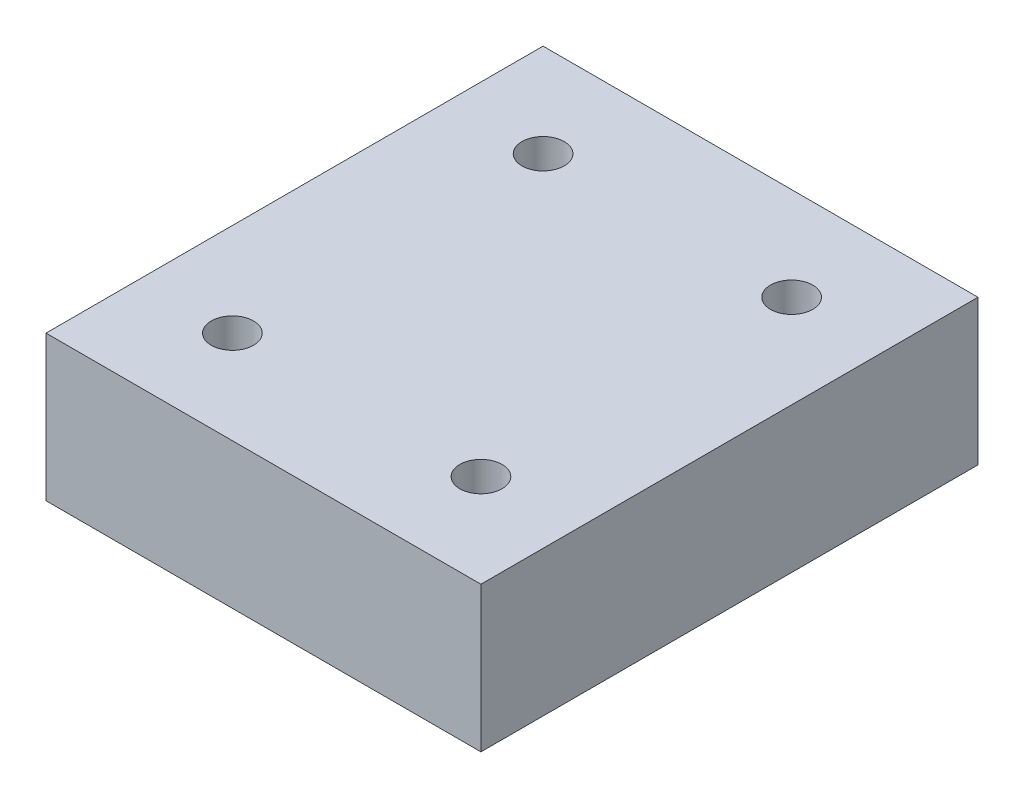
ISO-10303-21;
HEADER;
FILE_DESCRIPTION(('STEP AP214'),'2;1');
FILE_NAME('part.step','',(''),(''),'','','');
FILE_SCHEMA(('AUTOMOTIVE_DESIGN { 1 0 10303 214 1 1 1 1 }'));
ENDSEC;
DATA;
#1=APPLICATION_CONTEXT('core data for automotive mechanical design processes');
#2=APPLICATION_PROTOCOL_DEFINITION('international standard','automotive_design',2000,#1);
#3=PRODUCT_CONTEXT('',#1,'mechanical');
#4=PRODUCT('Part','Part','',(#3));
#5=PRODUCT_RELATED_PRODUCT_CATEGORY('part','',(#4));
#6=PRODUCT_DEFINITION_FORMATION('','',#4);
#7=PRODUCT_DEFINITION_CONTEXT('part definition',#1,'design');
#8=PRODUCT_DEFINITION('design','',#6,#7);
#9=PRODUCT_DEFINITION_SHAPE('','',#8);
#10=(LENGTH_UNIT() NAMED_UNIT(*) SI_UNIT(.MILLI.,.METRE.));
#11=(NAMED_UNIT(*) PLANE_ANGLE_UNIT() SI_UNIT($,.RADIAN.));
#12=(NAMED_UNIT(*) SI_UNIT($,.STERADIAN.) SOLID_ANGLE_UNIT());
#13=UNCERTAINTY_MEASURE_WITH_UNIT(LENGTH_MEASURE(1.E-05),#10,'distance_accuracy_value','');
#14=(GEOMETRIC_REPRESENTATION_CONTEXT(3) GLOBAL_UNCERTAINTY_ASSIGNED_CONTEXT((#13)) GLOBAL_UNIT_ASSIGNED_CONTEXT((#10,
#11,#12)) REPRESENTATION_CONTEXT('',''));
#15=CARTESIAN_POINT('',(0.,0.,0.));
#16=DIRECTION('',(0.,0.,1.));
#17=DIRECTION('',(1.,0.,0.));
#18=AXIS2_PLACEMENT_3D('',#15,#16,#17);
#19=CARTESIAN_POINT('',(17.5,11.6848633000707,20.));
#20=DIRECTION('',(-1.,0.,0.));
#21=DIRECTION('',(0.,0.,1.));
#22=AXIS2_PLACEMENT_3D('',#19,#20,#21);
#23=PLANE('',#22);
#24=DIRECTION('',(0.,0.,-1.));
#25=VECTOR('',#24,1.);
#26=CARTESIAN_POINT('',(17.5,0.,20.));
#27=LINE('',#26,#25);
#28=CARTESIAN_POINT('',(17.5,0.,20.));
#29=VERTEX_POINT('',#28);
#30=CARTESIAN_POINT('',(17.5,0.,-20.));
#31=VERTEX_POINT('',#30);
#32=EDGE_CURVE('E113',#29,#31,#27,.T.);
#33=ORIENTED_EDGE('',*,*,#32,.T.);
#34=DIRECTION('',(0.,-1.,0.));
#35=VECTOR('',#34,1.);
#36=CARTESIAN_POINT('',(17.5,11.6848633000707,-20.));
#37=LINE('',#36,#35);
#38=CARTESIAN_POINT('',(17.5,11.6848633000707,-20.));
#39=VERTEX_POINT('',#38);
#40=EDGE_CURVE('E11',#39,#31,#37,.T.);
#41=ORIENTED_EDGE('',*,*,#40,.F.);
#42=DIRECTION('',(0.,0.,-1.));
#43=VECTOR('',#42,1.);
#44=CARTESIAN_POINT('',(17.5,11.6848633000707,20.));
#45=LINE('',#44,#43);
#46=CARTESIAN_POINT('',(17.5,11.6848633000707,20.));
#47=VERTEX_POINT('',#46);
#48=EDGE_CURVE('E97',#47,#39,#45,.T.);
#49=ORIENTED_EDGE('',*,*,#48,.F.);
#50=DIRECTION('',(0.,-1.,0.));
#51=VECTOR('',#50,1.);
#52=CARTESIAN_POINT('',(17.5,11.6848633000707,20.));
#53=LINE('',#52,#51);
#54=EDGE_CURVE('E109',#47,#29,#53,.T.);
#55=ORIENTED_EDGE('',*,*,#54,.T.);
#56=EDGE_LOOP('',(#33,#41,#49,#55));
#57=FACE_BOUND('',#56,.T.);
#58=ADVANCED_FACE('F45',(#57),#23,.F.);
#59=CARTESIAN_POINT('',(-17.5,11.6848633000707,-20.));
#60=DIRECTION('',(0.,0.,1.));
#61=DIRECTION('',(1.,0.,0.));
#62=AXIS2_PLACEMENT_3D('',#59,#60,#61);
#63=PLANE('',#62);
#64=DIRECTION('',(-1.,0.,0.));
#65=VECTOR('',#64,1.);
#66=CARTESIAN_POINT('',(-17.5,0.,-20.));
#67=LINE('',#66,#65);
#68=CARTESIAN_POINT('',(-17.5,0.,-20.));
#69=VERTEX_POINT('',#68);
#70=EDGE_CURVE('E102',#31,#69,#67,.T.);
#71=ORIENTED_EDGE('',*,*,#70,.T.);
#72=DIRECTION('',(0.,-1.,0.));
#73=VECTOR('',#72,1.);
#74=CARTESIAN_POINT('',(-17.5,11.6848633000707,-20.));
#75=LINE('',#74,#73);
#76=CARTESIAN_POINT('',(-17.5,11.6848633000707,-20.));
#77=VERTEX_POINT('',#76);
#78=EDGE_CURVE('E54',#77,#69,#75,.T.);
#79=ORIENTED_EDGE('',*,*,#78,.F.);
#80=DIRECTION('',(-1.,0.,0.));
#81=VECTOR('',#80,1.);
#82=CARTESIAN_POINT('',(-17.5,11.6848633000707,-20.));
#83=LINE('',#82,#81);
#84=EDGE_CURVE('E92',#39,#77,#83,.T.);
#85=ORIENTED_EDGE('',*,*,#84,.F.);
#86=ORIENTED_EDGE('',*,*,#40,.T.);
#87=EDGE_LOOP('',(#71,#79,#85,#86));
#88=FACE_BOUND('',#87,.T.);
#89=ADVANCED_FACE('F101',(#88),#63,.F.);
#90=CARTESIAN_POINT('',(-17.5,11.6848633000707,20.));
#91=DIRECTION('',(1.,0.,0.));
#92=DIRECTION('',(0.,0.,-1.));
#93=AXIS2_PLACEMENT_3D('',#90,#91,#92);
#94=PLANE('',#93);
#95=DIRECTION('',(0.,0.,1.));
#96=VECTOR('',#95,1.);
#97=CARTESIAN_POINT('',(-17.5,0.,20.));
#98=LINE('',#97,#96);
#99=CARTESIAN_POINT('',(-17.5,0.,20.));
#100=VERTEX_POINT('',#99);
#101=EDGE_CURVE('E79',#69,#100,#98,.T.);
#102=ORIENTED_EDGE('',*,*,#101,.T.);
#103=DIRECTION('',(0.,-1.,0.));
#104=VECTOR('',#103,1.);
#105=CARTESIAN_POINT('',(-17.5,11.6848633000707,20.));
#106=LINE('',#105,#104);
#107=CARTESIAN_POINT('',(-17.5,11.6848633000707,20.));
#108=VERTEX_POINT('',#107);
#109=EDGE_CURVE('E104',#108,#100,#106,.T.);
#110=ORIENTED_EDGE('',*,*,#109,.F.);
#111=DIRECTION('',(0.,0.,1.));
#112=VECTOR('',#111,1.);
#113=CARTESIAN_POINT('',(-17.5,11.6848633000707,20.));
#114=LINE('',#113,#112);
#115=EDGE_CURVE('E95',#77,#108,#114,.T.);
#116=ORIENTED_EDGE('',*,*,#115,.F.);
#117=ORIENTED_EDGE('',*,*,#78,.T.);
#118=EDGE_LOOP('',(#102,#110,#116,#117));
#119=FACE_BOUND('',#118,.T.);
#120=ADVANCED_FACE('F105',(#119),#94,.F.);
#121=CARTESIAN_POINT('',(-17.5,11.6848633000707,20.));
#122=DIRECTION('',(0.,0.,-1.));
#123=DIRECTION('',(-1.,0.,0.));
#124=AXIS2_PLACEMENT_3D('',#121,#122,#123);
#125=PLANE('',#124);
#126=DIRECTION('',(1.,0.,0.));
#127=VECTOR('',#126,1.);
#128=CARTESIAN_POINT('',(-17.5,0.,20.));
#129=LINE('',#128,#127);
#130=EDGE_CURVE('E85',#100,#29,#129,.T.);
#131=ORIENTED_EDGE('',*,*,#130,.T.);
#132=ORIENTED_EDGE('',*,*,#54,.F.);
#133=DIRECTION('',(1.,0.,0.));
#134=VECTOR('',#133,1.);
#135=CARTESIAN_POINT('',(-17.5,11.6848633000707,20.));
#136=LINE('',#135,#134);
#137=EDGE_CURVE('E62',#108,#47,#136,.T.);
#138=ORIENTED_EDGE('',*,*,#137,.F.);
#139=ORIENTED_EDGE('',*,*,#109,.T.);
#140=EDGE_LOOP('',(#131,#132,#138,#139));
#141=FACE_BOUND('',#140,.T.);
#142=ADVANCED_FACE('F127',(#141),#125,.F.);
#143=CARTESIAN_POINT('',(0.,11.6848633000707,0.));
#144=DIRECTION('',(0.,-1.,0.));
#145=DIRECTION('',(0.,0.,-1.));
#146=AXIS2_PLACEMENT_3D('',#143,#144,#145);
#147=PLANE('',#146);
#148=CARTESIAN_POINT('',(10.,11.6848633000707,-12.5));
#149=DIRECTION('',(0.,1.,0.));
#150=DIRECTION('',(0.,0.,1.));
#151=AXIS2_PLACEMENT_3D('',#148,#149,#150);
#152=CIRCLE('',#151,1.7);
#153=CARTESIAN_POINT('',(10.,11.6848633000707,-10.8));
#154=VERTEX_POINT('',#153);
#155=EDGE_CURVE('E141',#154,#154,#152,.T.);
#156=ORIENTED_EDGE('',*,*,#155,.F.);
#157=EDGE_LOOP('',(#156));
#158=FACE_BOUND('',#157,.T.);
#159=CARTESIAN_POINT('',(-10.,11.6848633000707,12.5));
#160=DIRECTION('',(0.,1.,0.));
#161=DIRECTION('',(0.,0.,1.));
#162=AXIS2_PLACEMENT_3D('',#159,#160,#161);
#163=CIRCLE('',#162,1.7);
#164=CARTESIAN_POINT('',(-10.,11.6848633000707,14.2));
#165=VERTEX_POINT('',#164);
#166=EDGE_CURVE('E142',#165,#165,#163,.T.);
#167=ORIENTED_EDGE('',*,*,#166,.F.);
#168=EDGE_LOOP('',(#167));
#169=FACE_BOUND('',#168,.T.);
#170=CARTESIAN_POINT('',(10.,11.6848633000707,12.5));
#171=DIRECTION('',(0.,1.,0.));
#172=DIRECTION('',(0.,0.,1.));
#173=AXIS2_PLACEMENT_3D('',#170,#171,#172);
#174=CIRCLE('',#173,1.7);
#175=CARTESIAN_POINT('',(10.,11.6848633000707,14.2));
#176=VERTEX_POINT('',#175);
#177=EDGE_CURVE('E151',#176,#176,#174,.T.);
#178=ORIENTED_EDGE('',*,*,#177,.F.);
#179=EDGE_LOOP('',(#178));
#180=FACE_BOUND('',#179,.T.);
#181=CARTESIAN_POINT('',(-10.,11.6848633000707,-12.5));
#182=DIRECTION('',(0.,1.,0.));
#183=DIRECTION('',(0.,0.,1.));
#184=AXIS2_PLACEMENT_3D('',#181,#182,#183);
#185=CIRCLE('',#184,1.7);
#186=CARTESIAN_POINT('',(-10.,11.6848633000707,-10.8));
#187=VERTEX_POINT('',#186);
#188=EDGE_CURVE('E137',#187,#187,#185,.T.);
#189=ORIENTED_EDGE('',*,*,#188,.F.);
#190=EDGE_LOOP('',(#189));
#191=FACE_BOUND('',#190,.T.);
#192=ORIENTED_EDGE('',*,*,#48,.T.);
#193=ORIENTED_EDGE('',*,*,#84,.T.);
#194=ORIENTED_EDGE('',*,*,#115,.T.);
#195=ORIENTED_EDGE('',*,*,#137,.T.);
#196=EDGE_LOOP('',(#192,#193,#194,#195));
#197=FACE_BOUND('',#196,.T.);
#198=ADVANCED_FACE('F93',(#158,#169,#180,#191,#197),#147,.F.);
#199=CARTESIAN_POINT('',(0.,0.,0.));
#200=DIRECTION('',(0.,-1.,0.));
#201=DIRECTION('',(0.,0.,-1.));
#202=AXIS2_PLACEMENT_3D('',#199,#200,#201);
#203=PLANE('',#202);
#204=CARTESIAN_POINT('',(10.,0.,-12.5));
#205=DIRECTION('',(0.,-1.,0.));
#206=DIRECTION('',(0.,0.,-1.));
#207=AXIS2_PLACEMENT_3D('',#204,#205,#206);
#208=CIRCLE('',#207,1.7);
#209=CARTESIAN_POINT('',(10.,0.,-14.2));
#210=VERTEX_POINT('',#209);
#211=EDGE_CURVE('E146',#210,#210,#208,.F.);
#212=ORIENTED_EDGE('',*,*,#211,.T.);
#213=EDGE_LOOP('',(#212));
#214=FACE_BOUND('',#213,.T.);
#215=CARTESIAN_POINT('',(-10.,0.,12.5));
#216=DIRECTION('',(0.,-1.,0.));
#217=DIRECTION('',(0.,0.,-1.));
#218=AXIS2_PLACEMENT_3D('',#215,#216,#217);
#219=CIRCLE('',#218,1.7);
#220=CARTESIAN_POINT('',(-10.,0.,10.8));
#221=VERTEX_POINT('',#220);
#222=EDGE_CURVE('E147',#221,#221,#219,.F.);
#223=ORIENTED_EDGE('',*,*,#222,.T.);
#224=EDGE_LOOP('',(#223));
#225=FACE_BOUND('',#224,.T.);
#226=CARTESIAN_POINT('',(10.,0.,12.5));
#227=DIRECTION('',(0.,-1.,0.));
#228=DIRECTION('',(0.,0.,-1.));
#229=AXIS2_PLACEMENT_3D('',#226,#227,#228);
#230=CIRCLE('',#229,1.7);
#231=CARTESIAN_POINT('',(10.,0.,10.8));
#232=VERTEX_POINT('',#231);
#233=EDGE_CURVE('E161',#232,#232,#230,.F.);
#234=ORIENTED_EDGE('',*,*,#233,.T.);
#235=EDGE_LOOP('',(#234));
#236=FACE_BOUND('',#235,.T.);
#237=CARTESIAN_POINT('',(-10.,0.,-12.5));
#238=DIRECTION('',(0.,-1.,0.));
#239=DIRECTION('',(0.,0.,-1.));
#240=AXIS2_PLACEMENT_3D('',#237,#238,#239);
#241=CIRCLE('',#240,1.7);
#242=CARTESIAN_POINT('',(-10.,0.,-14.2));
#243=VERTEX_POINT('',#242);
#244=EDGE_CURVE('E117',#243,#243,#241,.F.);
#245=ORIENTED_EDGE('',*,*,#244,.T.);
#246=EDGE_LOOP('',(#245));
#247=FACE_BOUND('',#246,.T.);
#248=ORIENTED_EDGE('',*,*,#32,.F.);
#249=ORIENTED_EDGE('',*,*,#130,.F.);
#250=ORIENTED_EDGE('',*,*,#101,.F.);
#251=ORIENTED_EDGE('',*,*,#70,.F.);
#252=EDGE_LOOP('',(#248,#249,#250,#251));
#253=FACE_BOUND('',#252,.T.);
#254=ADVANCED_FACE('F130',(#214,#225,#236,#247,#253),#203,.T.);
#255=CARTESIAN_POINT('',(-10.,-4.80832611206852,-12.5));
#256=DIRECTION('',(0.,1.,0.));
#257=DIRECTION('',(0.,0.,1.));
#258=AXIS2_PLACEMENT_3D('',#255,#256,#257);
#259=CYLINDRICAL_SURFACE('',#258,1.7);
#260=ORIENTED_EDGE('',*,*,#188,.T.);
#261=EDGE_LOOP('',(#260));
#262=FACE_BOUND('',#261,.T.);
#263=ORIENTED_EDGE('',*,*,#244,.F.);
#264=EDGE_LOOP('',(#263));
#265=FACE_BOUND('',#264,.T.);
#266=ADVANCED_FACE('F171',(#262,#265),#259,.F.);
#267=CARTESIAN_POINT('',(10.,-4.80832611206852,12.5));
#268=DIRECTION('',(0.,1.,0.));
#269=DIRECTION('',(0.,0.,1.));
#270=AXIS2_PLACEMENT_3D('',#267,#268,#269);
#271=CYLINDRICAL_SURFACE('',#270,1.7);
#272=ORIENTED_EDGE('',*,*,#177,.T.);
#273=EDGE_LOOP('',(#272));
#274=FACE_BOUND('',#273,.T.);
#275=ORIENTED_EDGE('',*,*,#233,.F.);
#276=EDGE_LOOP('',(#275));
#277=FACE_BOUND('',#276,.T.);
#278=ADVANCED_FACE('F168',(#274,#277),#271,.F.);
#279=CARTESIAN_POINT('',(-10.,-4.80832611206852,12.5));
#280=DIRECTION('',(0.,1.,0.));
#281=DIRECTION('',(0.,0.,1.));
#282=AXIS2_PLACEMENT_3D('',#279,#280,#281);
#283=CYLINDRICAL_SURFACE('',#282,1.7);
#284=ORIENTED_EDGE('',*,*,#166,.T.);
#285=EDGE_LOOP('',(#284));
#286=FACE_BOUND('',#285,.T.);
#287=ORIENTED_EDGE('',*,*,#222,.F.);
#288=EDGE_LOOP('',(#287));
#289=FACE_BOUND('',#288,.T.);
#290=ADVANCED_FACE('F170',(#286,#289),#283,.F.);
#291=CARTESIAN_POINT('',(10.,-4.80832611206852,-12.5));
#292=DIRECTION('',(0.,1.,0.));
#293=DIRECTION('',(0.,0.,1.));
#294=AXIS2_PLACEMENT_3D('',#291,#292,#293);
#295=CYLINDRICAL_SURFACE('',#294,1.7);
#296=ORIENTED_EDGE('',*,*,#155,.T.);
#297=EDGE_LOOP('',(#296));
#298=FACE_BOUND('',#297,.T.);
#299=ORIENTED_EDGE('',*,*,#211,.F.);
#300=EDGE_LOOP('',(#299));
#301=FACE_BOUND('',#300,.T.);
#302=ADVANCED_FACE('F178',(#298,#301),#295,.F.);
#303=CLOSED_SHELL('',(#58,#89,#120,#142,#198,#254,#266,#278,#290,#302));
#304=MANIFOLD_SOLID_BREP('B2',#303);
#305=ADVANCED_BREP_SHAPE_REPRESENTATION('',(#18,#304),#14);
#306=SHAPE_DEFINITION_REPRESENTATION(#9,#305);
ENDSEC;
END-ISO-10303-21;
